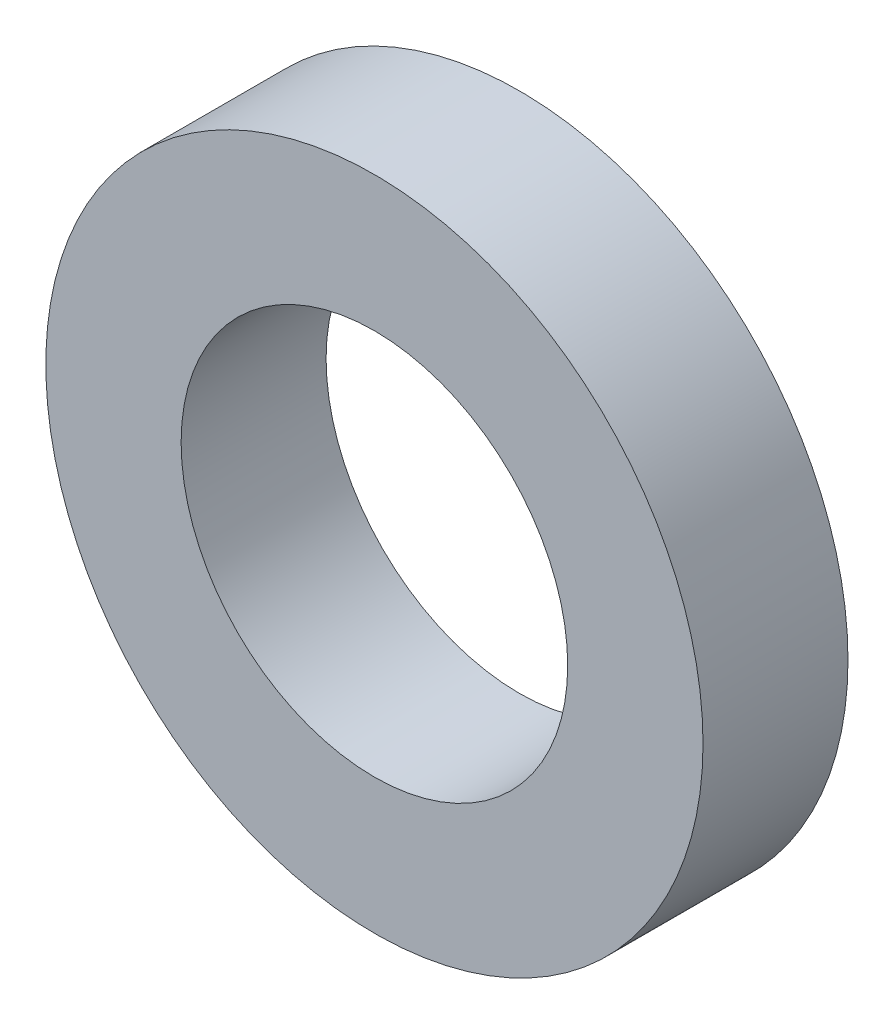
ISO-10303-21;
HEADER;
FILE_DESCRIPTION(('STEP AP214'),'2;1');
FILE_NAME('part.step','',(''),(''),'','','');
FILE_SCHEMA(('AUTOMOTIVE_DESIGN { 1 0 10303 214 1 1 1 1 }'));
ENDSEC;
DATA;
#1=APPLICATION_CONTEXT('core data for automotive mechanical design processes');
#2=APPLICATION_PROTOCOL_DEFINITION('international standard','automotive_design',2000,#1);
#3=PRODUCT_CONTEXT('',#1,'mechanical');
#4=PRODUCT('Part','Part','',(#3));
#5=PRODUCT_RELATED_PRODUCT_CATEGORY('part','',(#4));
#6=PRODUCT_DEFINITION_FORMATION('','',#4);
#7=PRODUCT_DEFINITION_CONTEXT('part definition',#1,'design');
#8=PRODUCT_DEFINITION('design','',#6,#7);
#9=PRODUCT_DEFINITION_SHAPE('','',#8);
#10=(LENGTH_UNIT() NAMED_UNIT(*) SI_UNIT(.MILLI.,.METRE.));
#11=(NAMED_UNIT(*) PLANE_ANGLE_UNIT() SI_UNIT($,.RADIAN.));
#12=(NAMED_UNIT(*) SI_UNIT($,.STERADIAN.) SOLID_ANGLE_UNIT());
#13=UNCERTAINTY_MEASURE_WITH_UNIT(LENGTH_MEASURE(1.E-05),#10,'distance_accuracy_value','');
#14=(GEOMETRIC_REPRESENTATION_CONTEXT(3) GLOBAL_UNCERTAINTY_ASSIGNED_CONTEXT((#13)) GLOBAL_UNIT_ASSIGNED_CONTEXT((#10,
#11,#12)) REPRESENTATION_CONTEXT('',''));
#15=CARTESIAN_POINT('',(0.,0.,0.));
#16=DIRECTION('',(0.,0.,1.));
#17=DIRECTION('',(1.,0.,0.));
#18=AXIS2_PLACEMENT_3D('',#15,#16,#17);
#19=CARTESIAN_POINT('',(0.,0.,7.5));
#20=DIRECTION('',(0.,0.,1.));
#21=DIRECTION('',(1.,0.,0.));
#22=AXIS2_PLACEMENT_3D('',#19,#20,#21);
#23=PLANE('',#22);
#24=CARTESIAN_POINT('',(0.,0.,7.5));
#25=DIRECTION('',(0.,0.,1.));
#26=DIRECTION('',(1.,0.,0.));
#27=AXIS2_PLACEMENT_3D('',#24,#25,#26);
#28=CIRCLE('',#27,34.);
#29=CARTESIAN_POINT('',(34.,0.,7.5));
#30=VERTEX_POINT('',#29);
#31=EDGE_CURVE('E10',#30,#30,#28,.T.);
#32=ORIENTED_EDGE('',*,*,#31,.T.);
#33=EDGE_LOOP('',(#32));
#34=FACE_BOUND('',#33,.T.);
#35=CARTESIAN_POINT('',(0.,0.,7.5));
#36=DIRECTION('',(0.,0.,1.));
#37=DIRECTION('',(1.,0.,0.));
#38=AXIS2_PLACEMENT_3D('',#35,#36,#37);
#39=CIRCLE('',#38,20.);
#40=CARTESIAN_POINT('',(20.,0.,7.5));
#41=VERTEX_POINT('',#40);
#42=EDGE_CURVE('E41',#41,#41,#39,.T.);
#43=ORIENTED_EDGE('',*,*,#42,.F.);
#44=EDGE_LOOP('',(#43));
#45=FACE_BOUND('',#44,.T.);
#46=ADVANCED_FACE('F30',(#34,#45),#23,.T.);
#47=CARTESIAN_POINT('',(0.,0.,-7.5));
#48=DIRECTION('',(0.,0.,1.));
#49=DIRECTION('',(1.,0.,0.));
#50=AXIS2_PLACEMENT_3D('',#47,#48,#49);
#51=PLANE('',#50);
#52=CARTESIAN_POINT('',(0.,0.,-7.5));
#53=DIRECTION('',(0.,0.,1.));
#54=DIRECTION('',(1.,0.,0.));
#55=AXIS2_PLACEMENT_3D('',#52,#53,#54);
#56=CIRCLE('',#55,34.);
#57=CARTESIAN_POINT('',(34.,0.,-7.5));
#58=VERTEX_POINT('',#57);
#59=EDGE_CURVE('E34',#58,#58,#56,.T.);
#60=ORIENTED_EDGE('',*,*,#59,.F.);
#61=EDGE_LOOP('',(#60));
#62=FACE_BOUND('',#61,.T.);
#63=CARTESIAN_POINT('',(0.,0.,-7.5));
#64=DIRECTION('',(0.,0.,1.));
#65=DIRECTION('',(1.,0.,0.));
#66=AXIS2_PLACEMENT_3D('',#63,#64,#65);
#67=CIRCLE('',#66,20.);
#68=CARTESIAN_POINT('',(20.,0.,-7.5));
#69=VERTEX_POINT('',#68);
#70=EDGE_CURVE('E43',#69,#69,#67,.T.);
#71=ORIENTED_EDGE('',*,*,#70,.T.);
#72=EDGE_LOOP('',(#71));
#73=FACE_BOUND('',#72,.T.);
#74=ADVANCED_FACE('F53',(#62,#73),#51,.F.);
#75=CARTESIAN_POINT('',(0.,0.,7.5));
#76=DIRECTION('',(0.,0.,-1.));
#77=DIRECTION('',(-1.,0.,0.));
#78=AXIS2_PLACEMENT_3D('',#75,#76,#77);
#79=CYLINDRICAL_SURFACE('',#78,34.);
#80=ORIENTED_EDGE('',*,*,#31,.F.);
#81=EDGE_LOOP('',(#80));
#82=FACE_BOUND('',#81,.T.);
#83=ORIENTED_EDGE('',*,*,#59,.T.);
#84=EDGE_LOOP('',(#83));
#85=FACE_BOUND('',#84,.T.);
#86=ADVANCED_FACE('F32',(#82,#85),#79,.T.);
#87=CARTESIAN_POINT('',(0.,0.,7.5));
#88=DIRECTION('',(0.,0.,-1.));
#89=DIRECTION('',(-1.,0.,0.));
#90=AXIS2_PLACEMENT_3D('',#87,#88,#89);
#91=CYLINDRICAL_SURFACE('',#90,20.);
#92=ORIENTED_EDGE('',*,*,#42,.T.);
#93=EDGE_LOOP('',(#92));
#94=FACE_BOUND('',#93,.T.);
#95=ORIENTED_EDGE('',*,*,#70,.F.);
#96=EDGE_LOOP('',(#95));
#97=FACE_BOUND('',#96,.T.);
#98=ADVANCED_FACE('F49',(#94,#97),#91,.F.);
#99=CLOSED_SHELL('',(#46,#74,#86,#98));
#100=MANIFOLD_SOLID_BREP('B2',#99);
#101=ADVANCED_BREP_SHAPE_REPRESENTATION('',(#18,#100),#14);
#102=SHAPE_DEFINITION_REPRESENTATION(#9,#101);
ENDSEC;
END-ISO-10303-21;
